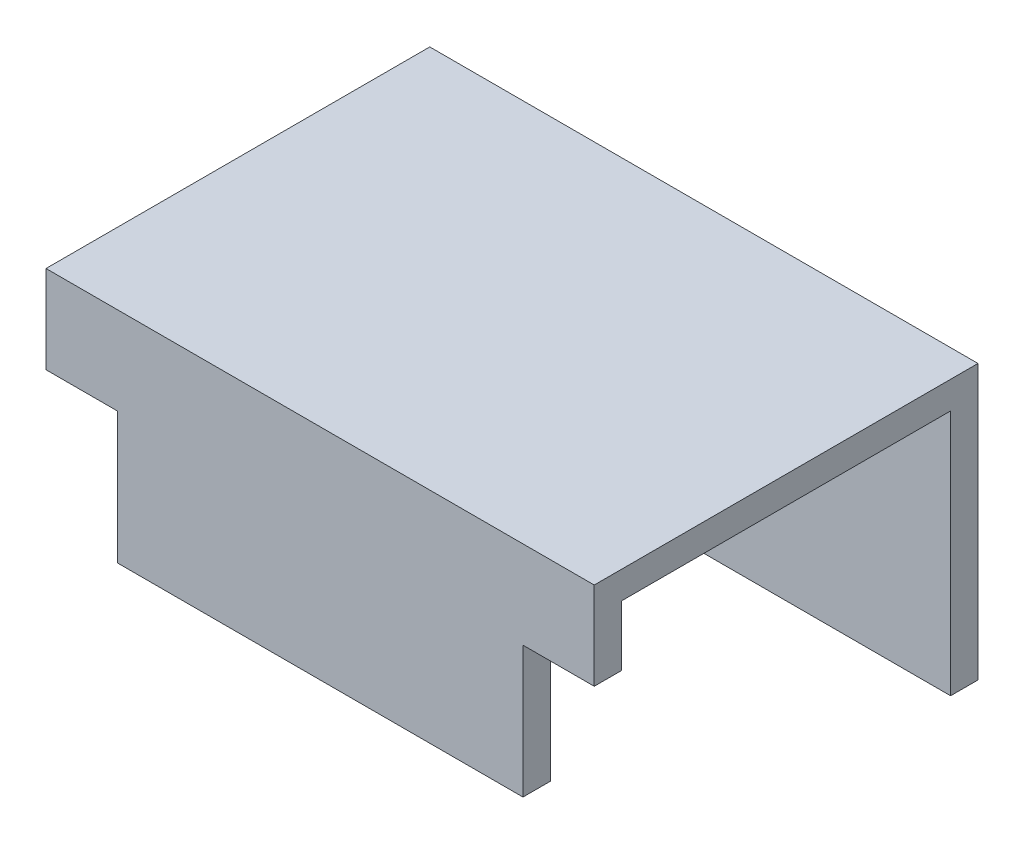
ISO-10303-21;
HEADER;
FILE_DESCRIPTION(('STEP AP214'),'2;1');
FILE_NAME('part.step','',(''),(''),'','','');
FILE_SCHEMA(('AUTOMOTIVE_DESIGN { 1 0 10303 214 1 1 1 1 }'));
ENDSEC;
DATA;
#1=APPLICATION_CONTEXT('core data for automotive mechanical design processes');
#2=APPLICATION_PROTOCOL_DEFINITION('international standard','automotive_design',2000,#1);
#3=PRODUCT_CONTEXT('',#1,'mechanical');
#4=PRODUCT('Part','Part','',(#3));
#5=PRODUCT_RELATED_PRODUCT_CATEGORY('part','',(#4));
#6=PRODUCT_DEFINITION_FORMATION('','',#4);
#7=PRODUCT_DEFINITION_CONTEXT('part definition',#1,'design');
#8=PRODUCT_DEFINITION('design','',#6,#7);
#9=PRODUCT_DEFINITION_SHAPE('','',#8);
#10=(LENGTH_UNIT() NAMED_UNIT(*) SI_UNIT(.MILLI.,.METRE.));
#11=(NAMED_UNIT(*) PLANE_ANGLE_UNIT() SI_UNIT($,.RADIAN.));
#12=(NAMED_UNIT(*) SI_UNIT($,.STERADIAN.) SOLID_ANGLE_UNIT());
#13=UNCERTAINTY_MEASURE_WITH_UNIT(LENGTH_MEASURE(1.E-05),#10,'distance_accuracy_value','');
#14=(GEOMETRIC_REPRESENTATION_CONTEXT(3) GLOBAL_UNCERTAINTY_ASSIGNED_CONTEXT((#13)) GLOBAL_UNIT_ASSIGNED_CONTEXT((#10,
#11,#12)) REPRESENTATION_CONTEXT('',''));
#15=CARTESIAN_POINT('',(0.,0.,0.));
#16=DIRECTION('',(0.,0.,1.));
#17=DIRECTION('',(1.,0.,0.));
#18=AXIS2_PLACEMENT_3D('',#15,#16,#17);
#19=CARTESIAN_POINT('',(70.0460000000667,70.404,2.33825400003794));
#20=DIRECTION('',(1.,0.,-2.05103428515331E-10));
#21=DIRECTION('',(-2.05103428515331E-10,0.,-1.));
#22=AXIS2_PLACEMENT_3D('',#19,#20,#21);
#23=PLANE('',#22);
#24=DIRECTION('',(0.,0.,1.));
#25=VECTOR('',#24,1.);
#26=CARTESIAN_POINT('',(70.0460000000718,70.524,2.33825400005128));
#27=LINE('',#26,#25);
#28=CARTESIAN_POINT('',(70.0460000000718,70.524,2.36325400004127));
#29=VERTEX_POINT('',#28);
#30=CARTESIAN_POINT('',(70.0460000000692,70.524,2.33825400003794));
#31=VERTEX_POINT('',#30);
#32=EDGE_CURVE('E20',#29,#31,#27,.F.);
#33=ORIENTED_EDGE('',*,*,#32,.T.);
#34=DIRECTION('',(0.,1.,0.));
#35=VECTOR('',#34,1.);
#36=CARTESIAN_POINT('',(70.0460000000667,71.0921246098625,2.33825400003795));
#37=LINE('',#36,#35);
#38=CARTESIAN_POINT('',(70.0460000000667,70.404,2.33825400001897));
#39=VERTEX_POINT('',#38);
#40=EDGE_CURVE('E103',#31,#39,#37,.F.);
#41=ORIENTED_EDGE('',*,*,#40,.T.);
#42=DIRECTION('',(0.,0.,1.));
#43=VECTOR('',#42,1.);
#44=CARTESIAN_POINT('',(70.0460000000667,70.404,2.36325399994872));
#45=LINE('',#44,#43);
#46=CARTESIAN_POINT('',(70.0460000000705,70.404,2.36325400003794));
#47=VERTEX_POINT('',#46);
#48=EDGE_CURVE('E111',#39,#47,#45,.T.);
#49=ORIENTED_EDGE('',*,*,#48,.T.);
#50=DIRECTION('',(0.,1.,0.));
#51=VECTOR('',#50,1.);
#52=CARTESIAN_POINT('',(70.0460000000718,71.0921246098625,2.36325400003794));
#53=LINE('',#52,#51);
#54=EDGE_CURVE('E108',#47,#29,#53,.T.);
#55=ORIENTED_EDGE('',*,*,#54,.T.);
#56=EDGE_LOOP('',(#33,#41,#49,#55));
#57=FACE_BOUND('',#56,.T.);
#58=ADVANCED_FACE('F17',(#57),#23,.F.);
#59=CARTESIAN_POINT('',(69.9810000000667,70.524,2.33825400005128));
#60=DIRECTION('',(0.,1.,0.));
#61=DIRECTION('',(-1.,0.,0.));
#62=AXIS2_PLACEMENT_3D('',#59,#60,#61);
#63=PLANE('',#62);
#64=DIRECTION('',(-2.05103428515331E-10,0.,-1.));
#65=VECTOR('',#64,1.);
#66=CARTESIAN_POINT('',(69.9810000000718,70.524,2.36325400005128));
#67=LINE('',#66,#65);
#68=CARTESIAN_POINT('',(69.9810000000693,70.524,2.36325400005128));
#69=VERTEX_POINT('',#68);
#70=CARTESIAN_POINT('',(69.9810000000667,70.524,2.33825400004461));
#71=VERTEX_POINT('',#70);
#72=EDGE_CURVE('E116',#69,#71,#67,.T.);
#73=ORIENTED_EDGE('',*,*,#72,.T.);
#74=DIRECTION('',(1.,0.,-2.05103428515331E-10));
#75=VECTOR('',#74,1.);
#76=CARTESIAN_POINT('',(69.9810000000667,70.524,2.33825400005128));
#77=LINE('',#76,#75);
#78=EDGE_CURVE('E113',#71,#31,#77,.T.);
#79=ORIENTED_EDGE('',*,*,#78,.T.);
#80=ORIENTED_EDGE('',*,*,#32,.F.);
#81=DIRECTION('',(-1.,0.,2.05103428515331E-10));
#82=VECTOR('',#81,1.);
#83=CARTESIAN_POINT('',(70.4810000000718,70.524,2.36325399994872));
#84=LINE('',#83,#82);
#85=EDGE_CURVE('E150',#29,#69,#84,.T.);
#86=ORIENTED_EDGE('',*,*,#85,.T.);
#87=EDGE_LOOP('',(#73,#79,#80,#86));
#88=FACE_BOUND('',#87,.T.);
#89=ADVANCED_FACE('F114',(#88),#63,.F.);
#90=CARTESIAN_POINT('',(70.4160000000667,70.404,2.33825399996206));
#91=DIRECTION('',(-1.,0.,2.05103428515331E-10));
#92=DIRECTION('',(2.05103428515331E-10,0.,1.));
#93=AXIS2_PLACEMENT_3D('',#90,#91,#92);
#94=PLANE('',#93);
#95=DIRECTION('',(0.,0.,1.));
#96=VECTOR('',#95,1.);
#97=CARTESIAN_POINT('',(70.4160000000718,70.404,2.36325399994872));
#98=LINE('',#97,#96);
#99=CARTESIAN_POINT('',(70.4160000000718,70.404,2.36325399998103));
#100=VERTEX_POINT('',#99);
#101=CARTESIAN_POINT('',(70.4160000000693,70.404,2.33825399996206));
#102=VERTEX_POINT('',#101);
#103=EDGE_CURVE('E136',#100,#102,#98,.F.);
#104=ORIENTED_EDGE('',*,*,#103,.T.);
#105=DIRECTION('',(0.,1.,0.));
#106=VECTOR('',#105,1.);
#107=CARTESIAN_POINT('',(70.4160000000667,71.0921246098625,2.33825399996206));
#108=LINE('',#107,#106);
#109=CARTESIAN_POINT('',(70.4160000000667,70.524,2.33825399995873));
#110=VERTEX_POINT('',#109);
#111=EDGE_CURVE('E128',#102,#110,#108,.T.);
#112=ORIENTED_EDGE('',*,*,#111,.T.);
#113=DIRECTION('',(0.,0.,1.));
#114=VECTOR('',#113,1.);
#115=CARTESIAN_POINT('',(70.4160000000667,70.524,2.33825399994873));
#116=LINE('',#115,#114);
#117=CARTESIAN_POINT('',(70.4160000000693,70.524,2.36325399996206));
#118=VERTEX_POINT('',#117);
#119=EDGE_CURVE('E169',#110,#118,#116,.T.);
#120=ORIENTED_EDGE('',*,*,#119,.T.);
#121=DIRECTION('',(0.,1.,0.));
#122=VECTOR('',#121,1.);
#123=CARTESIAN_POINT('',(70.4160000000718,71.0921246098625,2.36325399996205));
#124=LINE('',#123,#122);
#125=EDGE_CURVE('E146',#118,#100,#124,.F.);
#126=ORIENTED_EDGE('',*,*,#125,.T.);
#127=EDGE_LOOP('',(#104,#112,#120,#126));
#128=FACE_BOUND('',#127,.T.);
#129=ADVANCED_FACE('F174',(#128),#94,.F.);
#130=CARTESIAN_POINT('',(70.4810000000718,70.404,2.36325399994872));
#131=DIRECTION('',(0.,1.,0.));
#132=DIRECTION('',(0.,0.,1.));
#133=AXIS2_PLACEMENT_3D('',#130,#131,#132);
#134=PLANE('',#133);
#135=ORIENTED_EDGE('',*,*,#103,.F.);
#136=DIRECTION('',(-1.,0.,2.05103428515331E-10));
#137=VECTOR('',#136,1.);
#138=CARTESIAN_POINT('',(70.4810000000718,70.404,2.36325399994872));
#139=LINE('',#138,#137);
#140=EDGE_CURVE('E141',#100,#47,#139,.T.);
#141=ORIENTED_EDGE('',*,*,#140,.T.);
#142=ORIENTED_EDGE('',*,*,#48,.F.);
#143=DIRECTION('',(1.,0.,-2.05103428515331E-10));
#144=VECTOR('',#143,1.);
#145=CARTESIAN_POINT('',(69.9810000000667,70.404,2.33825400005128));
#146=LINE('',#145,#144);
#147=EDGE_CURVE('E126',#39,#102,#146,.T.);
#148=ORIENTED_EDGE('',*,*,#147,.T.);
#149=EDGE_LOOP('',(#135,#141,#142,#148));
#150=FACE_BOUND('',#149,.T.);
#151=ADVANCED_FACE('F142',(#150),#134,.F.);
#152=CARTESIAN_POINT('',(69.9810000000051,70.579,2.03825400005128));
#153=DIRECTION('',(-2.05103428515331E-10,0.,-1.));
#154=DIRECTION('',(-1.,0.,2.05103428515331E-10));
#155=AXIS2_PLACEMENT_3D('',#152,#153,#154);
#156=PLANE('',#155);
#157=DIRECTION('',(0.,1.,0.));
#158=VECTOR('',#157,1.);
#159=CARTESIAN_POINT('',(70.4810000000052,71.0921246098625,2.03825399994872));
#160=LINE('',#159,#158);
#161=CARTESIAN_POINT('',(70.4810000000026,70.354,2.03825399994872));
#162=VERTEX_POINT('',#161);
#163=CARTESIAN_POINT('',(70.4810000000051,70.579,2.03825399997436));
#164=VERTEX_POINT('',#163);
#165=EDGE_CURVE('E219',#162,#164,#160,.T.);
#166=ORIENTED_EDGE('',*,*,#165,.T.);
#167=DIRECTION('',(1.,0.,0.));
#168=VECTOR('',#167,1.);
#169=CARTESIAN_POINT('',(69.9810000000667,70.579,2.03825400005128));
#170=LINE('',#169,#168);
#171=CARTESIAN_POINT('',(69.9810000000359,70.579,2.03825400005128));
#172=VERTEX_POINT('',#171);
#173=EDGE_CURVE('E133',#172,#164,#170,.T.);
#174=ORIENTED_EDGE('',*,*,#173,.F.);
#175=DIRECTION('',(0.,1.,0.));
#176=VECTOR('',#175,1.);
#177=CARTESIAN_POINT('',(69.9810000000052,71.0921246098625,2.03825400005128));
#178=LINE('',#177,#176);
#179=CARTESIAN_POINT('',(69.9810000000051,70.354,2.03825400002564));
#180=VERTEX_POINT('',#179);
#181=EDGE_CURVE('E161',#172,#180,#178,.F.);
#182=ORIENTED_EDGE('',*,*,#181,.T.);
#183=DIRECTION('',(1.,0.,0.));
#184=VECTOR('',#183,1.);
#185=CARTESIAN_POINT('',(70.2310000000026,70.354,2.03825399994872));
#186=LINE('',#185,#184);
#187=EDGE_CURVE('E166',#162,#180,#186,.F.);
#188=ORIENTED_EDGE('',*,*,#187,.F.);
#189=EDGE_LOOP('',(#166,#174,#182,#188));
#190=FACE_BOUND('',#189,.T.);
#191=ADVANCED_FACE('F229',(#190),#156,.F.);
#192=CARTESIAN_POINT('',(69.9810000000667,70.579,2.33825400005128));
#193=DIRECTION('',(0.,-1.,0.));
#194=DIRECTION('',(0.,0.,-1.));
#195=AXIS2_PLACEMENT_3D('',#192,#193,#194);
#196=PLANE('',#195);
#197=DIRECTION('',(-2.05103428515331E-10,0.,-1.));
#198=VECTOR('',#197,1.);
#199=CARTESIAN_POINT('',(69.9810000000718,70.579,2.36325400005128));
#200=LINE('',#199,#198);
#201=CARTESIAN_POINT('',(69.9810000000667,70.579,2.338254));
#202=VERTEX_POINT('',#201);
#203=EDGE_CURVE('E163',#202,#172,#200,.T.);
#204=ORIENTED_EDGE('',*,*,#203,.T.);
#205=ORIENTED_EDGE('',*,*,#173,.T.);
#206=DIRECTION('',(2.05101260110986E-10,0.,1.));
#207=VECTOR('',#206,1.);
#208=CARTESIAN_POINT('',(70.4810000000667,70.579,2.33825399994872));
#209=LINE('',#208,#207);
#210=CARTESIAN_POINT('',(70.4810000000359,70.579,2.33825399994872));
#211=VERTEX_POINT('',#210);
#212=EDGE_CURVE('E217',#164,#211,#209,.T.);
#213=ORIENTED_EDGE('',*,*,#212,.T.);
#214=DIRECTION('',(1.,0.,-2.05103428515331E-10));
#215=VECTOR('',#214,1.);
#216=CARTESIAN_POINT('',(69.9810000000667,70.579,2.33825400005128));
#217=LINE('',#216,#215);
#218=EDGE_CURVE('E120',#211,#202,#217,.F.);
#219=ORIENTED_EDGE('',*,*,#218,.T.);
#220=EDGE_LOOP('',(#204,#205,#213,#219));
#221=FACE_BOUND('',#220,.T.);
#222=ADVANCED_FACE('F231',(#221),#196,.T.);
#223=CARTESIAN_POINT('',(69.9810000000667,71.0921246098625,2.33825400005128));
#224=DIRECTION('',(2.05103428515331E-10,0.,1.));
#225=DIRECTION('',(1.,0.,-2.05103428515331E-10));
#226=AXIS2_PLACEMENT_3D('',#223,#224,#225);
#227=PLANE('',#226);
#228=ORIENTED_EDGE('',*,*,#111,.F.);
#229=ORIENTED_EDGE('',*,*,#147,.F.);
#230=ORIENTED_EDGE('',*,*,#40,.F.);
#231=ORIENTED_EDGE('',*,*,#78,.F.);
#232=DIRECTION('',(0.,1.,0.));
#233=VECTOR('',#232,1.);
#234=CARTESIAN_POINT('',(69.9810000000667,71.0921246098625,2.33825400005128));
#235=LINE('',#234,#233);
#236=EDGE_CURVE('E151',#71,#202,#235,.T.);
#237=ORIENTED_EDGE('',*,*,#236,.T.);
#238=ORIENTED_EDGE('',*,*,#218,.F.);
#239=DIRECTION('',(0.,1.,0.));
#240=VECTOR('',#239,1.);
#241=CARTESIAN_POINT('',(70.4810000000667,71.0921246098625,2.33825399994872));
#242=LINE('',#241,#240);
#243=CARTESIAN_POINT('',(70.481000000068,70.524,2.33825399994873));
#244=VERTEX_POINT('',#243);
#245=EDGE_CURVE('E180',#211,#244,#242,.F.);
#246=ORIENTED_EDGE('',*,*,#245,.T.);
#247=DIRECTION('',(-1.,0.,0.));
#248=VECTOR('',#247,1.);
#249=CARTESIAN_POINT('',(70.4810000000667,70.524,2.33825399994873));
#250=LINE('',#249,#248);
#251=EDGE_CURVE('E171',#244,#110,#250,.T.);
#252=ORIENTED_EDGE('',*,*,#251,.T.);
#253=EDGE_LOOP('',(#228,#229,#230,#231,#237,#238,#246,#252));
#254=FACE_BOUND('',#253,.T.);
#255=ADVANCED_FACE('F124',(#254),#227,.F.);
#256=CARTESIAN_POINT('',(70.4810000000667,70.524,2.33825399994873));
#257=DIRECTION('',(0.,1.,0.));
#258=DIRECTION('',(-1.,0.,0.));
#259=AXIS2_PLACEMENT_3D('',#256,#257,#258);
#260=PLANE('',#259);
#261=ORIENTED_EDGE('',*,*,#119,.F.);
#262=ORIENTED_EDGE('',*,*,#251,.F.);
#263=DIRECTION('',(2.05101260110986E-10,0.,1.));
#264=VECTOR('',#263,1.);
#265=CARTESIAN_POINT('',(70.4810000000667,70.524,2.33825399994872));
#266=LINE('',#265,#264);
#267=CARTESIAN_POINT('',(70.4810000000718,70.524,2.36325399995539));
#268=VERTEX_POINT('',#267);
#269=EDGE_CURVE('E186',#244,#268,#266,.T.);
#270=ORIENTED_EDGE('',*,*,#269,.T.);
#271=DIRECTION('',(-1.,0.,2.05103428515331E-10));
#272=VECTOR('',#271,1.);
#273=CARTESIAN_POINT('',(70.4810000000718,70.524,2.36325399994872));
#274=LINE('',#273,#272);
#275=EDGE_CURVE('E185',#268,#118,#274,.T.);
#276=ORIENTED_EDGE('',*,*,#275,.T.);
#277=EDGE_LOOP('',(#261,#262,#270,#276));
#278=FACE_BOUND('',#277,.T.);
#279=ADVANCED_FACE('F183',(#278),#260,.F.);
#280=CARTESIAN_POINT('',(70.2310000000026,70.354,2.025754));
#281=DIRECTION('',(0.,-1.,0.));
#282=DIRECTION('',(0.,0.,-1.));
#283=AXIS2_PLACEMENT_3D('',#280,#281,#282);
#284=PLANE('',#283);
#285=DIRECTION('',(-2.05103428515331E-10,0.,-1.));
#286=VECTOR('',#285,1.);
#287=CARTESIAN_POINT('',(69.9810000000718,70.354,2.36325400005128));
#288=LINE('',#287,#286);
#289=CARTESIAN_POINT('',(69.9810000000013,70.354,2.01325400005128));
#290=VERTEX_POINT('',#289);
#291=EDGE_CURVE('E159',#180,#290,#288,.T.);
#292=ORIENTED_EDGE('',*,*,#291,.T.);
#293=DIRECTION('',(1.,0.,-2.05103428515331E-10));
#294=VECTOR('',#293,1.);
#295=CARTESIAN_POINT('',(70.481,70.354,2.01325399994872));
#296=LINE('',#295,#294);
#297=CARTESIAN_POINT('',(70.481,70.354,2.01325399997436));
#298=VERTEX_POINT('',#297);
#299=EDGE_CURVE('E205',#290,#298,#296,.T.);
#300=ORIENTED_EDGE('',*,*,#299,.T.);
#301=DIRECTION('',(2.05101260110986E-10,0.,1.));
#302=VECTOR('',#301,1.);
#303=CARTESIAN_POINT('',(70.4810000000667,70.354,2.33825399994872));
#304=LINE('',#303,#302);
#305=EDGE_CURVE('E145',#298,#162,#304,.T.);
#306=ORIENTED_EDGE('',*,*,#305,.T.);
#307=ORIENTED_EDGE('',*,*,#187,.T.);
#308=EDGE_LOOP('',(#292,#300,#306,#307));
#309=FACE_BOUND('',#308,.T.);
#310=ADVANCED_FACE('F223',(#309),#284,.T.);
#311=CARTESIAN_POINT('',(69.9810000000718,71.0921246098625,2.36325400005128));
#312=DIRECTION('',(1.,0.,-2.05103428515331E-10));
#313=DIRECTION('',(-2.05103428515331E-10,0.,-1.));
#314=AXIS2_PLACEMENT_3D('',#311,#312,#313);
#315=PLANE('',#314);
#316=ORIENTED_EDGE('',*,*,#72,.F.);
#317=DIRECTION('',(0.,1.,0.));
#318=VECTOR('',#317,1.);
#319=CARTESIAN_POINT('',(69.9810000000718,71.0921246098625,2.36325400005127));
#320=LINE('',#319,#318);
#321=CARTESIAN_POINT('',(69.9810000000539,70.604,2.36325400005128));
#322=VERTEX_POINT('',#321);
#323=EDGE_CURVE('E153',#69,#322,#320,.T.);
#324=ORIENTED_EDGE('',*,*,#323,.T.);
#325=DIRECTION('',(0.,0.,1.));
#326=VECTOR('',#325,1.);
#327=CARTESIAN_POINT('',(69.981,70.604,2.36325399994872));
#328=LINE('',#327,#326);
#329=CARTESIAN_POINT('',(69.981,70.604,2.01325400002564));
#330=VERTEX_POINT('',#329);
#331=EDGE_CURVE('E196',#330,#322,#328,.T.);
#332=ORIENTED_EDGE('',*,*,#331,.F.);
#333=DIRECTION('',(0.,1.,0.));
#334=VECTOR('',#333,1.);
#335=CARTESIAN_POINT('',(69.981,70.604,2.01325400005127));
#336=LINE('',#335,#334);
#337=EDGE_CURVE('E208',#330,#290,#336,.F.);
#338=ORIENTED_EDGE('',*,*,#337,.T.);
#339=ORIENTED_EDGE('',*,*,#291,.F.);
#340=ORIENTED_EDGE('',*,*,#181,.F.);
#341=ORIENTED_EDGE('',*,*,#203,.F.);
#342=ORIENTED_EDGE('',*,*,#236,.F.);
#343=EDGE_LOOP('',(#316,#324,#332,#338,#339,#340,#341,#342));
#344=FACE_BOUND('',#343,.T.);
#345=ADVANCED_FACE('F193',(#344),#315,.F.);
#346=CARTESIAN_POINT('',(70.4810000000718,71.0921246098625,2.36325399994872));
#347=DIRECTION('',(-2.05103428515331E-10,0.,-1.));
#348=DIRECTION('',(-1.,0.,2.05103428515331E-10));
#349=AXIS2_PLACEMENT_3D('',#346,#347,#348);
#350=PLANE('',#349);
#351=ORIENTED_EDGE('',*,*,#125,.F.);
#352=ORIENTED_EDGE('',*,*,#275,.F.);
#353=DIRECTION('',(0.,1.,0.));
#354=VECTOR('',#353,1.);
#355=CARTESIAN_POINT('',(70.4810000000718,71.0921246098625,2.36325399994873));
#356=LINE('',#355,#354);
#357=CARTESIAN_POINT('',(70.4810000000718,70.604,2.36325399997436));
#358=VERTEX_POINT('',#357);
#359=EDGE_CURVE('E200',#268,#358,#356,.T.);
#360=ORIENTED_EDGE('',*,*,#359,.T.);
#361=DIRECTION('',(1.,0.,0.));
#362=VECTOR('',#361,1.);
#363=CARTESIAN_POINT('',(70.4810000000718,70.604,2.36325400005128));
#364=LINE('',#363,#362);
#365=EDGE_CURVE('E199',#322,#358,#364,.T.);
#366=ORIENTED_EDGE('',*,*,#365,.F.);
#367=ORIENTED_EDGE('',*,*,#323,.F.);
#368=ORIENTED_EDGE('',*,*,#85,.F.);
#369=ORIENTED_EDGE('',*,*,#54,.F.);
#370=ORIENTED_EDGE('',*,*,#140,.F.);
#371=EDGE_LOOP('',(#351,#352,#360,#366,#367,#368,#369,#370));
#372=FACE_BOUND('',#371,.T.);
#373=ADVANCED_FACE('F148',(#372),#350,.F.);
#374=CARTESIAN_POINT('',(70.4810000000667,71.0921246098625,2.33825399994872));
#375=DIRECTION('',(-1.,0.,2.05101260110986E-10));
#376=DIRECTION('',(2.05101260110986E-10,0.,1.));
#377=AXIS2_PLACEMENT_3D('',#374,#375,#376);
#378=PLANE('',#377);
#379=ORIENTED_EDGE('',*,*,#269,.F.);
#380=ORIENTED_EDGE('',*,*,#245,.F.);
#381=ORIENTED_EDGE('',*,*,#212,.F.);
#382=ORIENTED_EDGE('',*,*,#165,.F.);
#383=ORIENTED_EDGE('',*,*,#305,.F.);
#384=DIRECTION('',(0.,1.,0.));
#385=VECTOR('',#384,1.);
#386=CARTESIAN_POINT('',(70.481,70.604,2.01325399994872));
#387=LINE('',#386,#385);
#388=CARTESIAN_POINT('',(70.481000000018,70.604,2.01325399994872));
#389=VERTEX_POINT('',#388);
#390=EDGE_CURVE('E35',#298,#389,#387,.T.);
#391=ORIENTED_EDGE('',*,*,#390,.T.);
#392=DIRECTION('',(0.,0.,1.));
#393=VECTOR('',#392,1.);
#394=CARTESIAN_POINT('',(70.4810000000718,70.604,2.36325399994872));
#395=LINE('',#394,#393);
#396=EDGE_CURVE('E26',#358,#389,#395,.F.);
#397=ORIENTED_EDGE('',*,*,#396,.F.);
#398=ORIENTED_EDGE('',*,*,#359,.F.);
#399=EDGE_LOOP('',(#379,#380,#381,#382,#383,#391,#397,#398));
#400=FACE_BOUND('',#399,.T.);
#401=ADVANCED_FACE('F227',(#400),#378,.F.);
#402=CARTESIAN_POINT('',(70.481,70.604,2.01325399994872));
#403=DIRECTION('',(2.05103428515331E-10,0.,1.));
#404=DIRECTION('',(1.,0.,-2.05103428515331E-10));
#405=AXIS2_PLACEMENT_3D('',#402,#403,#404);
#406=PLANE('',#405);
#407=ORIENTED_EDGE('',*,*,#337,.F.);
#408=DIRECTION('',(1.,0.,0.));
#409=VECTOR('',#408,1.);
#410=CARTESIAN_POINT('',(70.4810000000718,70.604,2.01325399994872));
#411=LINE('',#410,#409);
#412=EDGE_CURVE('E11',#389,#330,#411,.F.);
#413=ORIENTED_EDGE('',*,*,#412,.F.);
#414=ORIENTED_EDGE('',*,*,#390,.F.);
#415=ORIENTED_EDGE('',*,*,#299,.F.);
#416=EDGE_LOOP('',(#407,#413,#414,#415));
#417=FACE_BOUND('',#416,.T.);
#418=ADVANCED_FACE('F235',(#417),#406,.F.);
#419=CARTESIAN_POINT('',(70.4810000000718,70.604,2.36325399994872));
#420=DIRECTION('',(0.,1.,0.));
#421=DIRECTION('',(0.,0.,1.));
#422=AXIS2_PLACEMENT_3D('',#419,#420,#421);
#423=PLANE('',#422);
#424=ORIENTED_EDGE('',*,*,#396,.T.);
#425=ORIENTED_EDGE('',*,*,#412,.T.);
#426=ORIENTED_EDGE('',*,*,#331,.T.);
#427=ORIENTED_EDGE('',*,*,#365,.T.);
#428=EDGE_LOOP('',(#424,#425,#426,#427));
#429=FACE_BOUND('',#428,.T.);
#430=ADVANCED_FACE('F204',(#429),#423,.T.);
#431=CLOSED_SHELL('',(#58,#89,#129,#151,#191,#222,#255,#279,#310,#345,#373,#401,#418,#430));
#432=MANIFOLD_SOLID_BREP('B1',#431);
#433=ADVANCED_BREP_SHAPE_REPRESENTATION('',(#18,#432),#14);
#434=SHAPE_DEFINITION_REPRESENTATION(#9,#433);
ENDSEC;
END-ISO-10303-21;
